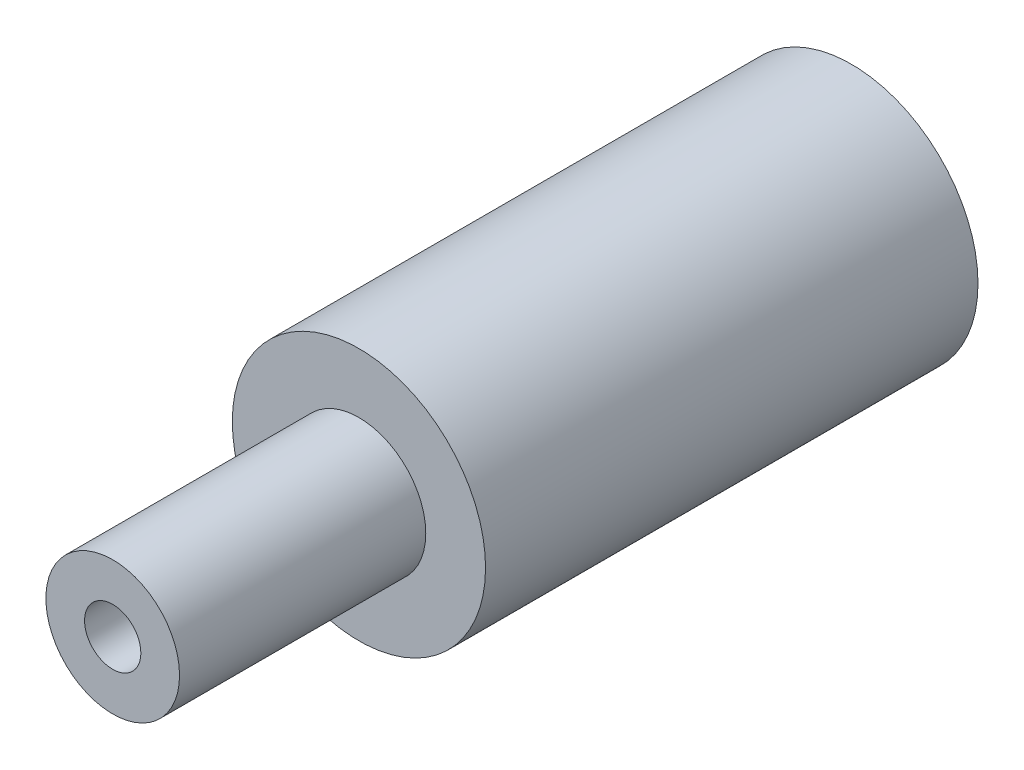
ISO-10303-21;
HEADER;
FILE_DESCRIPTION(('STEP AP214'),'2;1');
FILE_NAME('part.step','',(''),(''),'','','');
FILE_SCHEMA(('AUTOMOTIVE_DESIGN { 1 0 10303 214 1 1 1 1 }'));
ENDSEC;
DATA;
#1=APPLICATION_CONTEXT('core data for automotive mechanical design processes');
#2=APPLICATION_PROTOCOL_DEFINITION('international standard','automotive_design',2000,#1);
#3=PRODUCT_CONTEXT('',#1,'mechanical');
#4=PRODUCT('Part','Part','',(#3));
#5=PRODUCT_RELATED_PRODUCT_CATEGORY('part','',(#4));
#6=PRODUCT_DEFINITION_FORMATION('','',#4);
#7=PRODUCT_DEFINITION_CONTEXT('part definition',#1,'design');
#8=PRODUCT_DEFINITION('design','',#6,#7);
#9=PRODUCT_DEFINITION_SHAPE('','',#8);
#10=(LENGTH_UNIT() NAMED_UNIT(*) SI_UNIT(.MILLI.,.METRE.));
#11=(NAMED_UNIT(*) PLANE_ANGLE_UNIT() SI_UNIT($,.RADIAN.));
#12=(NAMED_UNIT(*) SI_UNIT($,.STERADIAN.) SOLID_ANGLE_UNIT());
#13=UNCERTAINTY_MEASURE_WITH_UNIT(LENGTH_MEASURE(1.E-05),#10,'distance_accuracy_value','');
#14=(GEOMETRIC_REPRESENTATION_CONTEXT(3) GLOBAL_UNCERTAINTY_ASSIGNED_CONTEXT((#13)) GLOBAL_UNIT_ASSIGNED_CONTEXT((#10,
#11,#12)) REPRESENTATION_CONTEXT('',''));
#15=CARTESIAN_POINT('',(0.,0.,0.));
#16=DIRECTION('',(0.,0.,1.));
#17=DIRECTION('',(1.,0.,0.));
#18=AXIS2_PLACEMENT_3D('',#15,#16,#17);
#19=CARTESIAN_POINT('',(0.,0.,70.));
#20=DIRECTION('',(0.,0.,1.));
#21=DIRECTION('',(1.,0.,0.));
#22=AXIS2_PLACEMENT_3D('',#19,#20,#21);
#23=PLANE('',#22);
#24=CARTESIAN_POINT('',(0.,0.,70.));
#25=DIRECTION('',(0.,0.,1.));
#26=DIRECTION('',(1.,0.,0.));
#27=AXIS2_PLACEMENT_3D('',#24,#25,#26);
#28=CIRCLE('',#27,18.);
#29=CARTESIAN_POINT('',(18.,0.,70.));
#30=VERTEX_POINT('',#29);
#31=EDGE_CURVE('E10',#30,#30,#28,.T.);
#32=ORIENTED_EDGE('',*,*,#31,.T.);
#33=EDGE_LOOP('',(#32));
#34=FACE_BOUND('',#33,.T.);
#35=CARTESIAN_POINT('',(0.,0.,70.));
#36=DIRECTION('',(0.,0.,1.));
#37=DIRECTION('',(1.,0.,0.));
#38=AXIS2_PLACEMENT_3D('',#35,#36,#37);
#39=CIRCLE('',#38,9.5);
#40=CARTESIAN_POINT('',(9.5,0.,70.));
#41=VERTEX_POINT('',#40);
#42=EDGE_CURVE('E67',#41,#41,#39,.T.);
#43=ORIENTED_EDGE('',*,*,#42,.F.);
#44=EDGE_LOOP('',(#43));
#45=FACE_BOUND('',#44,.T.);
#46=ADVANCED_FACE('F49',(#34,#45),#23,.T.);
#47=CARTESIAN_POINT('',(0.,0.,70.));
#48=DIRECTION('',(0.,0.,-1.));
#49=DIRECTION('',(-1.,0.,0.));
#50=AXIS2_PLACEMENT_3D('',#47,#48,#49);
#51=CYLINDRICAL_SURFACE('',#50,18.);
#52=ORIENTED_EDGE('',*,*,#31,.F.);
#53=EDGE_LOOP('',(#52));
#54=FACE_BOUND('',#53,.T.);
#55=CARTESIAN_POINT('',(0.,0.,0.));
#56=DIRECTION('',(0.,0.,1.));
#57=DIRECTION('',(1.,0.,0.));
#58=AXIS2_PLACEMENT_3D('',#55,#56,#57);
#59=CIRCLE('',#58,18.);
#60=CARTESIAN_POINT('',(18.,0.,0.));
#61=VERTEX_POINT('',#60);
#62=EDGE_CURVE('E53',#61,#61,#59,.T.);
#63=ORIENTED_EDGE('',*,*,#62,.T.);
#64=EDGE_LOOP('',(#63));
#65=FACE_BOUND('',#64,.T.);
#66=ADVANCED_FACE('F51',(#54,#65),#51,.T.);
#67=CARTESIAN_POINT('',(0.,0.,0.));
#68=DIRECTION('',(0.,0.,1.));
#69=DIRECTION('',(1.,0.,0.));
#70=AXIS2_PLACEMENT_3D('',#67,#68,#69);
#71=PLANE('',#70);
#72=ORIENTED_EDGE('',*,*,#62,.F.);
#73=EDGE_LOOP('',(#72));
#74=FACE_BOUND('',#73,.T.);
#75=ADVANCED_FACE('F103',(#74),#71,.F.);
#76=CARTESIAN_POINT('',(0.,0.,95.));
#77=DIRECTION('',(0.,0.,-1.));
#78=DIRECTION('',(-1.,0.,0.));
#79=AXIS2_PLACEMENT_3D('',#76,#77,#78);
#80=CYLINDRICAL_SURFACE('',#79,9.5);
#81=ORIENTED_EDGE('',*,*,#42,.T.);
#82=EDGE_LOOP('',(#81));
#83=FACE_BOUND('',#82,.T.);
#84=CARTESIAN_POINT('',(0.,0.,105.));
#85=DIRECTION('',(0.,0.,1.));
#86=DIRECTION('',(1.,0.,0.));
#87=AXIS2_PLACEMENT_3D('',#84,#85,#86);
#88=CIRCLE('',#87,9.5);
#89=CARTESIAN_POINT('',(9.5,0.,105.));
#90=VERTEX_POINT('',#89);
#91=EDGE_CURVE('E75',#90,#90,#88,.T.);
#92=ORIENTED_EDGE('',*,*,#91,.F.);
#93=EDGE_LOOP('',(#92));
#94=FACE_BOUND('',#93,.T.);
#95=ADVANCED_FACE('F93',(#83,#94),#80,.T.);
#96=CARTESIAN_POINT('',(0.,0.,105.));
#97=DIRECTION('',(0.,0.,1.));
#98=DIRECTION('',(1.,0.,0.));
#99=AXIS2_PLACEMENT_3D('',#96,#97,#98);
#100=PLANE('',#99);
#101=ORIENTED_EDGE('',*,*,#91,.T.);
#102=EDGE_LOOP('',(#101));
#103=FACE_BOUND('',#102,.T.);
#104=CARTESIAN_POINT('',(0.,0.,105.));
#105=DIRECTION('',(0.,0.,1.));
#106=DIRECTION('',(1.,0.,0.));
#107=AXIS2_PLACEMENT_3D('',#104,#105,#106);
#108=CIRCLE('',#107,4.);
#109=CARTESIAN_POINT('',(4.,0.,105.));
#110=VERTEX_POINT('',#109);
#111=EDGE_CURVE('E79',#110,#110,#108,.T.);
#112=ORIENTED_EDGE('',*,*,#111,.F.);
#113=EDGE_LOOP('',(#112));
#114=FACE_BOUND('',#113,.T.);
#115=ADVANCED_FACE('F91',(#103,#114),#100,.T.);
#116=CARTESIAN_POINT('',(0.,0.,105.));
#117=DIRECTION('',(0.,0.,-1.));
#118=DIRECTION('',(-1.,0.,0.));
#119=AXIS2_PLACEMENT_3D('',#116,#117,#118);
#120=CYLINDRICAL_SURFACE('',#119,4.);
#121=ORIENTED_EDGE('',*,*,#111,.T.);
#122=EDGE_LOOP('',(#121));
#123=FACE_BOUND('',#122,.T.);
#124=CARTESIAN_POINT('',(0.,0.,95.));
#125=DIRECTION('',(0.,0.,1.));
#126=DIRECTION('',(1.,0.,0.));
#127=AXIS2_PLACEMENT_3D('',#124,#125,#126);
#128=CIRCLE('',#127,4.);
#129=CARTESIAN_POINT('',(4.,0.,95.));
#130=VERTEX_POINT('',#129);
#131=EDGE_CURVE('E80',#130,#130,#128,.T.);
#132=ORIENTED_EDGE('',*,*,#131,.F.);
#133=EDGE_LOOP('',(#132));
#134=FACE_BOUND('',#133,.T.);
#135=ADVANCED_FACE('F88',(#123,#134),#120,.F.);
#136=CARTESIAN_POINT('',(0.,0.,86.));
#137=DIRECTION('',(0.,0.,1.));
#138=DIRECTION('',(1.,0.,0.));
#139=AXIS2_PLACEMENT_3D('',#136,#137,#138);
#140=PLANE('',#139);
#141=CARTESIAN_POINT('',(0.,0.,86.));
#142=DIRECTION('',(0.,0.,1.));
#143=DIRECTION('',(1.,0.,0.));
#144=AXIS2_PLACEMENT_3D('',#141,#142,#143);
#145=CIRCLE('',#144,2.5);
#146=CARTESIAN_POINT('',(2.5,0.,86.));
#147=VERTEX_POINT('',#146);
#148=EDGE_CURVE('E62',#147,#147,#145,.F.);
#149=ORIENTED_EDGE('',*,*,#148,.F.);
#150=EDGE_LOOP('',(#149));
#151=FACE_BOUND('',#150,.T.);
#152=ADVANCED_FACE('F100',(#151),#140,.T.);
#153=CARTESIAN_POINT('',(0.,0.,95.));
#154=DIRECTION('',(0.,0.,-1.));
#155=DIRECTION('',(-1.,0.,0.));
#156=AXIS2_PLACEMENT_3D('',#153,#154,#155);
#157=CYLINDRICAL_SURFACE('',#156,2.5);
#158=ORIENTED_EDGE('',*,*,#148,.T.);
#159=EDGE_LOOP('',(#158));
#160=FACE_BOUND('',#159,.T.);
#161=CARTESIAN_POINT('',(0.,0.,95.));
#162=DIRECTION('',(0.,0.,1.));
#163=DIRECTION('',(1.,0.,0.));
#164=AXIS2_PLACEMENT_3D('',#161,#162,#163);
#165=CIRCLE('',#164,2.5);
#166=CARTESIAN_POINT('',(2.5,0.,95.));
#167=VERTEX_POINT('',#166);
#168=EDGE_CURVE('E71',#167,#167,#165,.T.);
#169=ORIENTED_EDGE('',*,*,#168,.T.);
#170=EDGE_LOOP('',(#169));
#171=FACE_BOUND('',#170,.T.);
#172=ADVANCED_FACE('F132',(#160,#171),#157,.F.);
#173=CARTESIAN_POINT('',(0.,0.,95.));
#174=DIRECTION('',(0.,0.,1.));
#175=DIRECTION('',(1.,0.,0.));
#176=AXIS2_PLACEMENT_3D('',#173,#174,#175);
#177=PLANE('',#176);
#178=ORIENTED_EDGE('',*,*,#168,.F.);
#179=EDGE_LOOP('',(#178));
#180=FACE_BOUND('',#179,.T.);
#181=ORIENTED_EDGE('',*,*,#131,.T.);
#182=EDGE_LOOP('',(#181));
#183=FACE_BOUND('',#182,.T.);
#184=ADVANCED_FACE('F139',(#180,#183),#177,.T.);
#185=CLOSED_SHELL('',(#46,#66,#75,#95,#115,#135,#152,#172,#184));
#186=MANIFOLD_SOLID_BREP('B2',#185);
#187=ADVANCED_BREP_SHAPE_REPRESENTATION('',(#18,#186),#14);
#188=SHAPE_DEFINITION_REPRESENTATION(#9,#187);
ENDSEC;
END-ISO-10303-21;
